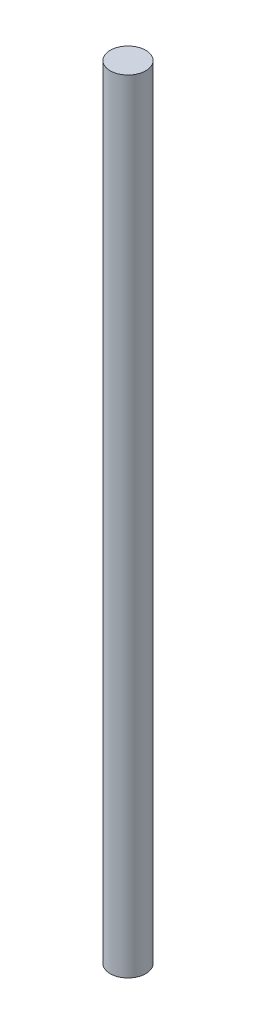
ISO-10303-21;
HEADER;
FILE_DESCRIPTION(('STEP AP214'),'2;1');
FILE_NAME('part.step','',(''),(''),'','','');
FILE_SCHEMA(('AUTOMOTIVE_DESIGN { 1 0 10303 214 1 1 1 1 }'));
ENDSEC;
DATA;
#1=APPLICATION_CONTEXT('core data for automotive mechanical design processes');
#2=APPLICATION_PROTOCOL_DEFINITION('international standard','automotive_design',2000,#1);
#3=PRODUCT_CONTEXT('',#1,'mechanical');
#4=PRODUCT('Part','Part','',(#3));
#5=PRODUCT_RELATED_PRODUCT_CATEGORY('part','',(#4));
#6=PRODUCT_DEFINITION_FORMATION('','',#4);
#7=PRODUCT_DEFINITION_CONTEXT('part definition',#1,'design');
#8=PRODUCT_DEFINITION('design','',#6,#7);
#9=PRODUCT_DEFINITION_SHAPE('','',#8);
#10=(LENGTH_UNIT() NAMED_UNIT(*) SI_UNIT(.MILLI.,.METRE.));
#11=(NAMED_UNIT(*) PLANE_ANGLE_UNIT() SI_UNIT($,.RADIAN.));
#12=(NAMED_UNIT(*) SI_UNIT($,.STERADIAN.) SOLID_ANGLE_UNIT());
#13=UNCERTAINTY_MEASURE_WITH_UNIT(LENGTH_MEASURE(1.E-05),#10,'distance_accuracy_value','');
#14=(GEOMETRIC_REPRESENTATION_CONTEXT(3) GLOBAL_UNCERTAINTY_ASSIGNED_CONTEXT((#13)) GLOBAL_UNIT_ASSIGNED_CONTEXT((#10,
#11,#12)) REPRESENTATION_CONTEXT('',''));
#15=CARTESIAN_POINT('',(0.,0.,0.));
#16=DIRECTION('',(0.,0.,1.));
#17=DIRECTION('',(1.,0.,0.));
#18=AXIS2_PLACEMENT_3D('',#15,#16,#17);
#19=CARTESIAN_POINT('',(0.,44.,0.));
#20=DIRECTION('',(0.,-1.,0.));
#21=DIRECTION('',(0.,0.,-1.));
#22=AXIS2_PLACEMENT_3D('',#19,#20,#21);
#23=CYLINDRICAL_SURFACE('',#22,1.);
#24=CARTESIAN_POINT('',(0.,44.,0.));
#25=DIRECTION('',(0.,1.,0.));
#26=DIRECTION('',(0.,0.,1.));
#27=AXIS2_PLACEMENT_3D('',#24,#25,#26);
#28=CIRCLE('',#27,1.);
#29=CARTESIAN_POINT('',(0.,44.,1.));
#30=VERTEX_POINT('',#29);
#31=EDGE_CURVE('E10',#30,#30,#28,.T.);
#32=ORIENTED_EDGE('',*,*,#31,.F.);
#33=EDGE_LOOP('',(#32));
#34=FACE_BOUND('',#33,.T.);
#35=CARTESIAN_POINT('',(0.,0.,0.));
#36=DIRECTION('',(0.,1.,0.));
#37=DIRECTION('',(0.,0.,1.));
#38=AXIS2_PLACEMENT_3D('',#35,#36,#37);
#39=CIRCLE('',#38,1.);
#40=CARTESIAN_POINT('',(0.,0.,1.));
#41=VERTEX_POINT('',#40);
#42=EDGE_CURVE('E42',#41,#41,#39,.T.);
#43=ORIENTED_EDGE('',*,*,#42,.T.);
#44=EDGE_LOOP('',(#43));
#45=FACE_BOUND('',#44,.T.);
#46=ADVANCED_FACE('F39',(#34,#45),#23,.T.);
#47=CARTESIAN_POINT('',(0.,44.,0.));
#48=DIRECTION('',(0.,1.,0.));
#49=DIRECTION('',(0.,0.,1.));
#50=AXIS2_PLACEMENT_3D('',#47,#48,#49);
#51=PLANE('',#50);
#52=ORIENTED_EDGE('',*,*,#31,.T.);
#53=EDGE_LOOP('',(#52));
#54=FACE_BOUND('',#53,.T.);
#55=ADVANCED_FACE('F54',(#54),#51,.T.);
#56=CARTESIAN_POINT('',(0.,0.,0.));
#57=DIRECTION('',(0.,1.,0.));
#58=DIRECTION('',(0.,0.,1.));
#59=AXIS2_PLACEMENT_3D('',#56,#57,#58);
#60=PLANE('',#59);
#61=ORIENTED_EDGE('',*,*,#42,.F.);
#62=EDGE_LOOP('',(#61));
#63=FACE_BOUND('',#62,.T.);
#64=ADVANCED_FACE('F52',(#63),#60,.F.);
#65=CLOSED_SHELL('',(#46,#55,#64));
#66=MANIFOLD_SOLID_BREP('B2',#65);
#67=ADVANCED_BREP_SHAPE_REPRESENTATION('',(#18,#66),#14);
#68=SHAPE_DEFINITION_REPRESENTATION(#9,#67);
ENDSEC;
END-ISO-10303-21;
